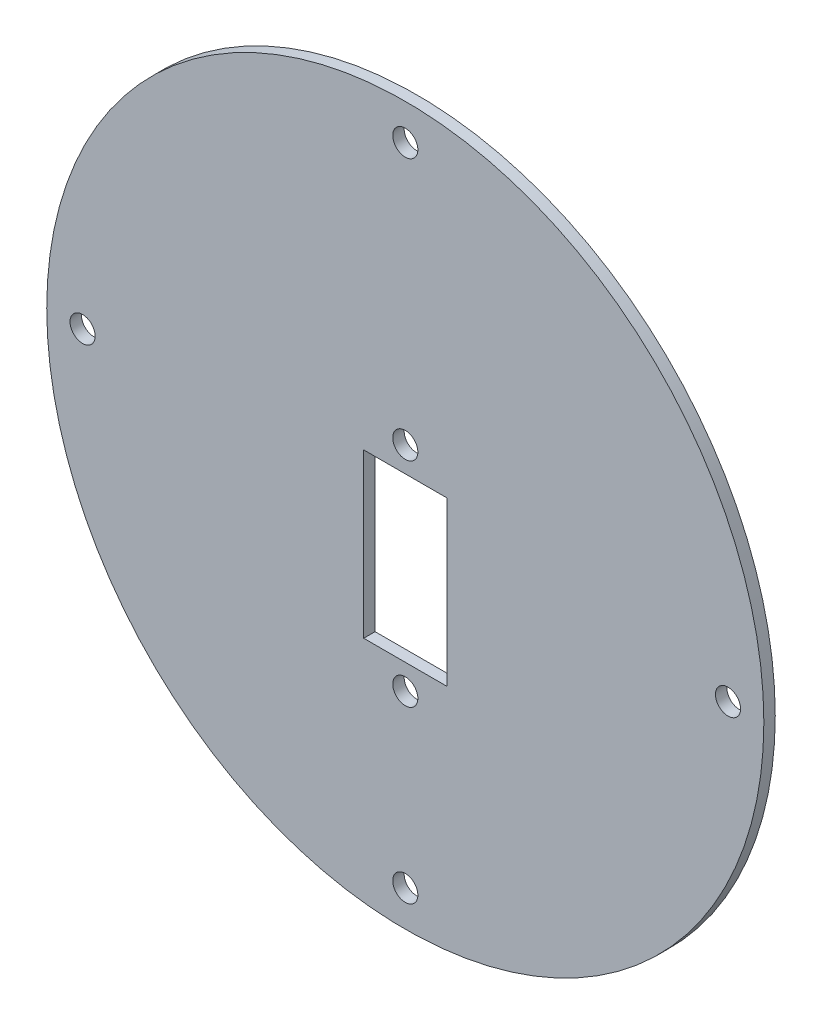
ISO-10303-21;
HEADER;
FILE_DESCRIPTION(('STEP AP214'),'2;1');
FILE_NAME('part.step','',(''),(''),'','','');
FILE_SCHEMA(('AUTOMOTIVE_DESIGN { 1 0 10303 214 1 1 1 1 }'));
ENDSEC;
DATA;
#1=APPLICATION_CONTEXT('core data for automotive mechanical design processes');
#2=APPLICATION_PROTOCOL_DEFINITION('international standard','automotive_design',2000,#1);
#3=PRODUCT_CONTEXT('',#1,'mechanical');
#4=PRODUCT('Part','Part','',(#3));
#5=PRODUCT_RELATED_PRODUCT_CATEGORY('part','',(#4));
#6=PRODUCT_DEFINITION_FORMATION('','',#4);
#7=PRODUCT_DEFINITION_CONTEXT('part definition',#1,'design');
#8=PRODUCT_DEFINITION('design','',#6,#7);
#9=PRODUCT_DEFINITION_SHAPE('','',#8);
#10=(LENGTH_UNIT() NAMED_UNIT(*) SI_UNIT(.MILLI.,.METRE.));
#11=(NAMED_UNIT(*) PLANE_ANGLE_UNIT() SI_UNIT($,.RADIAN.));
#12=(NAMED_UNIT(*) SI_UNIT($,.STERADIAN.) SOLID_ANGLE_UNIT());
#13=UNCERTAINTY_MEASURE_WITH_UNIT(LENGTH_MEASURE(1.E-05),#10,'distance_accuracy_value','');
#14=(GEOMETRIC_REPRESENTATION_CONTEXT(3) GLOBAL_UNCERTAINTY_ASSIGNED_CONTEXT((#13)) GLOBAL_UNIT_ASSIGNED_CONTEXT((#10,
#11,#12)) REPRESENTATION_CONTEXT('',''));
#15=CARTESIAN_POINT('',(0.,0.,0.));
#16=DIRECTION('',(0.,0.,1.));
#17=DIRECTION('',(1.,0.,0.));
#18=AXIS2_PLACEMENT_3D('',#15,#16,#17);
#19=CARTESIAN_POINT('',(0.,0.,1.59));
#20=DIRECTION('',(0.,0.,-1.));
#21=DIRECTION('',(-1.,0.,0.));
#22=AXIS2_PLACEMENT_3D('',#19,#20,#21);
#23=CYLINDRICAL_SURFACE('',#22,50.);
#24=CARTESIAN_POINT('',(0.,0.,1.59));
#25=DIRECTION('',(0.,0.,1.));
#26=DIRECTION('',(1.,0.,0.));
#27=AXIS2_PLACEMENT_3D('',#24,#25,#26);
#28=CIRCLE('',#27,50.);
#29=CARTESIAN_POINT('',(-50.,0.,1.59));
#30=VERTEX_POINT('',#29);
#31=EDGE_CURVE('E131',#30,#30,#28,.T.);
#32=CARTESIAN_POINT('',(0.,0.,0.));
#33=DIRECTION('',(0.,0.,1.));
#34=DIRECTION('',(1.,0.,0.));
#35=AXIS2_PLACEMENT_3D('',#32,#33,#34);
#36=CIRCLE('',#35,50.);
#37=CARTESIAN_POINT('',(-50.,0.,0.));
#38=VERTEX_POINT('',#37);
#39=EDGE_CURVE('E128',#38,#38,#36,.T.);
#40=CARTESIAN_POINT('',(-50.,0.,1.59));
#41=CARTESIAN_POINT('',(-50.,0.,1.5734375));
#42=CARTESIAN_POINT('',(-50.,0.,1.556875));
#43=CARTESIAN_POINT('',(-50.,0.,1.52375));
#44=CARTESIAN_POINT('',(-50.,0.,1.5071875));
#45=CARTESIAN_POINT('',(-50.,0.,1.4740625));
#46=CARTESIAN_POINT('',(-50.,0.,1.4575));
#47=CARTESIAN_POINT('',(-50.,0.,1.424375));
#48=CARTESIAN_POINT('',(-50.,0.,1.4078125));
#49=CARTESIAN_POINT('',(-50.,0.,1.3746875));
#50=CARTESIAN_POINT('',(-50.,0.,1.358125));
#51=CARTESIAN_POINT('',(-50.,0.,1.325));
#52=CARTESIAN_POINT('',(-50.,0.,1.3084375));
#53=CARTESIAN_POINT('',(-50.,0.,1.2753125));
#54=CARTESIAN_POINT('',(-50.,0.,1.25875));
#55=CARTESIAN_POINT('',(-50.,0.,1.225625));
#56=CARTESIAN_POINT('',(-50.,0.,1.2090625));
#57=CARTESIAN_POINT('',(-50.,0.,1.1759375));
#58=CARTESIAN_POINT('',(-50.,0.,1.159375));
#59=CARTESIAN_POINT('',(-50.,0.,1.12625));
#60=CARTESIAN_POINT('',(-50.,0.,1.1096875));
#61=CARTESIAN_POINT('',(-50.,0.,1.0765625));
#62=CARTESIAN_POINT('',(-50.,0.,1.06));
#63=CARTESIAN_POINT('',(-50.,0.,1.026875));
#64=CARTESIAN_POINT('',(-50.,0.,1.0103125));
#65=CARTESIAN_POINT('',(-50.,0.,0.9771875));
#66=CARTESIAN_POINT('',(-50.,0.,0.960625));
#67=CARTESIAN_POINT('',(-50.,0.,0.9275));
#68=CARTESIAN_POINT('',(-50.,0.,0.9109375));
#69=CARTESIAN_POINT('',(-50.,0.,0.8778125));
#70=CARTESIAN_POINT('',(-50.,0.,0.86125));
#71=CARTESIAN_POINT('',(-50.,0.,0.828125));
#72=CARTESIAN_POINT('',(-50.,0.,0.8115625));
#73=CARTESIAN_POINT('',(-50.,0.,0.7784375));
#74=CARTESIAN_POINT('',(-50.,0.,0.761875));
#75=CARTESIAN_POINT('',(-50.,0.,0.72875));
#76=CARTESIAN_POINT('',(-50.,0.,0.7121875));
#77=CARTESIAN_POINT('',(-50.,0.,0.6790625));
#78=CARTESIAN_POINT('',(-50.,0.,0.6625));
#79=CARTESIAN_POINT('',(-50.,0.,0.629375));
#80=CARTESIAN_POINT('',(-50.,0.,0.6128125));
#81=CARTESIAN_POINT('',(-50.,0.,0.5796875));
#82=CARTESIAN_POINT('',(-50.,0.,0.563125));
#83=CARTESIAN_POINT('',(-50.,0.,0.53));
#84=CARTESIAN_POINT('',(-50.,0.,0.5134375));
#85=CARTESIAN_POINT('',(-50.,0.,0.4803125));
#86=CARTESIAN_POINT('',(-50.,0.,0.46375));
#87=CARTESIAN_POINT('',(-50.,0.,0.430625));
#88=CARTESIAN_POINT('',(-50.,0.,0.4140625));
#89=CARTESIAN_POINT('',(-50.,0.,0.3809375));
#90=CARTESIAN_POINT('',(-50.,0.,0.364375));
#91=CARTESIAN_POINT('',(-50.,0.,0.33125));
#92=CARTESIAN_POINT('',(-50.,0.,0.3146875));
#93=CARTESIAN_POINT('',(-50.,0.,0.2815625));
#94=CARTESIAN_POINT('',(-50.,0.,0.265));
#95=CARTESIAN_POINT('',(-50.,0.,0.231875));
#96=CARTESIAN_POINT('',(-50.,0.,0.2153125));
#97=CARTESIAN_POINT('',(-50.,0.,0.1821875));
#98=CARTESIAN_POINT('',(-50.,0.,0.165625));
#99=CARTESIAN_POINT('',(-50.,0.,0.1325));
#100=CARTESIAN_POINT('',(-50.,0.,0.1159375));
#101=CARTESIAN_POINT('',(-50.,0.,0.0828125000000001));
#102=CARTESIAN_POINT('',(-50.,0.,0.06625));
#103=CARTESIAN_POINT('',(-50.,0.,0.033125));
#104=CARTESIAN_POINT('',(-50.,0.,0.0165625));
#105=CARTESIAN_POINT('',(-50.,0.,0.));
#106=B_SPLINE_CURVE_WITH_KNOTS('',3,(#40,#41,#42,#43,#44,#45,#46,#47,#48,#49,#50,#51,#52,#53,
#54,#55,#56,#57,#58,#59,#60,#61,#62,#63,#64,#65,#66,#67,#68,#69,#70,#71,#72,#73,#74,#75,#76,#77,
#78,#79,#80,#81,#82,#83,#84,#85,#86,#87,#88,#89,#90,#91,#92,#93,#94,#95,#96,#97,#98,#99,#100,
#101,#102,#103,#104,#105),.UNSPECIFIED.,.F.,.F.,(4,2,2,2,2,2,2,2,2,2,2,2,2,2,2,2,2,2,2,2,2,2,2,
2,2,2,2,2,2,2,2,2,4),(0.,0.0496875,0.0993750000000001,0.1490625,0.19875,0.2484375,0.298125,
0.3478125,0.3975,0.4471875,0.496875,0.5465625,0.59625,0.6459375,0.695625,0.7453125,0.795,
0.8446875,0.894375,0.9440625,0.99375,1.0434375,1.093125,1.1428125,1.1925,1.2421875,1.291875,
1.3415625,1.39125,1.4409375,1.490625,1.5403125,1.59),.UNSPECIFIED.);
#107=EDGE_CURVE('BSEAM36',#30,#38,#106,.T.);
#108=ORIENTED_EDGE('',*,*,#31,.F.);
#109=ORIENTED_EDGE('',*,*,#39,.T.);
#110=ORIENTED_EDGE('',*,*,#107,.T.);
#111=ORIENTED_EDGE('',*,*,#107,.F.);
#112=EDGE_LOOP('',(#108,#110,#109,#111));
#113=FACE_BOUND('',#112,.T.);
#114=ADVANCED_FACE('F36',(#113),#23,.T.);
#115=CARTESIAN_POINT('',(0.,0.,1.59));
#116=DIRECTION('',(0.,0.,1.));
#117=DIRECTION('',(1.,0.,0.));
#118=AXIS2_PLACEMENT_3D('',#115,#116,#117);
#119=PLANE('',#118);
#120=CARTESIAN_POINT('',(0.,8.5,1.59));
#121=DIRECTION('',(0.,0.,1.));
#122=DIRECTION('',(1.,0.,0.));
#123=AXIS2_PLACEMENT_3D('',#120,#121,#122);
#124=CIRCLE('',#123,1.75);
#125=CARTESIAN_POINT('',(1.75,8.5,1.59));
#126=VERTEX_POINT('',#125);
#127=EDGE_CURVE('E142',#126,#126,#124,.T.);
#128=ORIENTED_EDGE('',*,*,#127,.F.);
#129=EDGE_LOOP('',(#128));
#130=FACE_BOUND('',#129,.T.);
#131=CARTESIAN_POINT('',(0.,-21.25,1.59));
#132=DIRECTION('',(0.,0.,1.));
#133=DIRECTION('',(1.,0.,0.));
#134=AXIS2_PLACEMENT_3D('',#131,#132,#133);
#135=CIRCLE('',#134,1.75);
#136=CARTESIAN_POINT('',(1.75,-21.25,1.59));
#137=VERTEX_POINT('',#136);
#138=EDGE_CURVE('E147',#137,#137,#135,.T.);
#139=ORIENTED_EDGE('',*,*,#138,.F.);
#140=EDGE_LOOP('',(#139));
#141=FACE_BOUND('',#140,.T.);
#142=DIRECTION('',(0.,1.,0.));
#143=VECTOR('',#142,1.);
#144=CARTESIAN_POINT('',(5.8,5.,1.59));
#145=LINE('',#144,#143);
#146=CARTESIAN_POINT('',(5.8,-17.75,1.59));
#147=VERTEX_POINT('',#146);
#148=CARTESIAN_POINT('',(5.8,5.,1.59));
#149=VERTEX_POINT('',#148);
#150=EDGE_CURVE('E52',#147,#149,#145,.T.);
#151=ORIENTED_EDGE('',*,*,#150,.F.);
#152=DIRECTION('',(1.,0.,0.));
#153=VECTOR('',#152,1.);
#154=CARTESIAN_POINT('',(-5.8,-17.75,1.59));
#155=LINE('',#154,#153);
#156=CARTESIAN_POINT('',(-5.8,-17.75,1.59));
#157=VERTEX_POINT('',#156);
#158=EDGE_CURVE('E97',#157,#147,#155,.T.);
#159=ORIENTED_EDGE('',*,*,#158,.F.);
#160=DIRECTION('',(0.,-1.,0.));
#161=VECTOR('',#160,1.);
#162=CARTESIAN_POINT('',(-5.8,5.,1.59));
#163=LINE('',#162,#161);
#164=CARTESIAN_POINT('',(-5.8,5.,1.59));
#165=VERTEX_POINT('',#164);
#166=EDGE_CURVE('E81',#165,#157,#163,.T.);
#167=ORIENTED_EDGE('',*,*,#166,.F.);
#168=DIRECTION('',(-1.,0.,0.));
#169=VECTOR('',#168,1.);
#170=CARTESIAN_POINT('',(-5.8,5.,1.59));
#171=LINE('',#170,#169);
#172=EDGE_CURVE('E90',#149,#165,#171,.T.);
#173=ORIENTED_EDGE('',*,*,#172,.F.);
#174=EDGE_LOOP('',(#151,#159,#167,#173));
#175=FACE_BOUND('',#174,.T.);
#176=CARTESIAN_POINT('',(45.0000000000013,1.27346601377202E-12,1.59));
#177=DIRECTION('',(0.,0.,1.));
#178=DIRECTION('',(1.,0.,0.));
#179=AXIS2_PLACEMENT_3D('',#176,#177,#178);
#180=CIRCLE('',#179,1.750000000001);
#181=CARTESIAN_POINT('',(46.7500000000023,1.27346601377202E-12,1.59));
#182=VERTEX_POINT('',#181);
#183=EDGE_CURVE('E111',#182,#182,#180,.T.);
#184=ORIENTED_EDGE('',*,*,#183,.F.);
#185=EDGE_LOOP('',(#184));
#186=FACE_BOUND('',#185,.T.);
#187=CARTESIAN_POINT('',(2.54693202754404E-12,-45.,1.59));
#188=DIRECTION('',(0.,0.,1.));
#189=DIRECTION('',(1.,0.,0.));
#190=AXIS2_PLACEMENT_3D('',#187,#188,#189);
#191=CIRCLE('',#190,1.75000000000274);
#192=CARTESIAN_POINT('',(1.75000000000529,-45.,1.59));
#193=VERTEX_POINT('',#192);
#194=EDGE_CURVE('E117',#193,#193,#191,.T.);
#195=ORIENTED_EDGE('',*,*,#194,.F.);
#196=EDGE_LOOP('',(#195));
#197=FACE_BOUND('',#196,.T.);
#198=CARTESIAN_POINT('',(-44.9999999999987,-1.27897692436818E-12,1.59));
#199=DIRECTION('',(0.,0.,1.));
#200=DIRECTION('',(1.,0.,0.));
#201=AXIS2_PLACEMENT_3D('',#198,#199,#200);
#202=CIRCLE('',#201,1.75000000000205);
#203=CARTESIAN_POINT('',(-43.2499999999967,-1.27897692436818E-12,1.59));
#204=VERTEX_POINT('',#203);
#205=EDGE_CURVE('E104',#204,#204,#202,.T.);
#206=ORIENTED_EDGE('',*,*,#205,.F.);
#207=EDGE_LOOP('',(#206));
#208=FACE_BOUND('',#207,.T.);
#209=CARTESIAN_POINT('',(0.,45.,1.59));
#210=DIRECTION('',(0.,0.,1.));
#211=DIRECTION('',(1.,0.,0.));
#212=AXIS2_PLACEMENT_3D('',#209,#210,#211);
#213=CIRCLE('',#212,1.75);
#214=CARTESIAN_POINT('',(1.75,45.,1.59));
#215=VERTEX_POINT('',#214);
#216=EDGE_CURVE('E110',#215,#215,#213,.T.);
#217=ORIENTED_EDGE('',*,*,#216,.F.);
#218=EDGE_LOOP('',(#217));
#219=FACE_BOUND('',#218,.T.);
#220=ORIENTED_EDGE('',*,*,#31,.T.);
#221=EDGE_LOOP('',(#220));
#222=FACE_BOUND('',#221,.T.);
#223=ADVANCED_FACE('F94',(#130,#141,#175,#186,#197,#208,#219,#222),#119,.T.);
#224=CARTESIAN_POINT('',(0.,0.,0.));
#225=DIRECTION('',(0.,0.,1.));
#226=DIRECTION('',(1.,0.,0.));
#227=AXIS2_PLACEMENT_3D('',#224,#225,#226);
#228=PLANE('',#227);
#229=CARTESIAN_POINT('',(0.,8.5,0.));
#230=DIRECTION('',(0.,0.,1.));
#231=DIRECTION('',(1.,0.,0.));
#232=AXIS2_PLACEMENT_3D('',#229,#230,#231);
#233=CIRCLE('',#232,1.75);
#234=CARTESIAN_POINT('',(1.75,8.5,0.));
#235=VERTEX_POINT('',#234);
#236=EDGE_CURVE('E39',#235,#235,#233,.T.);
#237=ORIENTED_EDGE('',*,*,#236,.T.);
#238=EDGE_LOOP('',(#237));
#239=FACE_BOUND('',#238,.T.);
#240=CARTESIAN_POINT('',(0.,-21.25,0.));
#241=DIRECTION('',(0.,0.,1.));
#242=DIRECTION('',(1.,0.,0.));
#243=AXIS2_PLACEMENT_3D('',#240,#241,#242);
#244=CIRCLE('',#243,1.75);
#245=CARTESIAN_POINT('',(1.75,-21.25,0.));
#246=VERTEX_POINT('',#245);
#247=EDGE_CURVE('E140',#246,#246,#244,.T.);
#248=ORIENTED_EDGE('',*,*,#247,.T.);
#249=EDGE_LOOP('',(#248));
#250=FACE_BOUND('',#249,.T.);
#251=DIRECTION('',(1.,0.,0.));
#252=VECTOR('',#251,1.);
#253=CARTESIAN_POINT('',(0.,-17.75,0.));
#254=LINE('',#253,#252);
#255=CARTESIAN_POINT('',(-5.8,-17.75,0.));
#256=VERTEX_POINT('',#255);
#257=CARTESIAN_POINT('',(5.8,-17.75,0.));
#258=VERTEX_POINT('',#257);
#259=EDGE_CURVE('E44',#256,#258,#254,.T.);
#260=ORIENTED_EDGE('',*,*,#259,.T.);
#261=DIRECTION('',(0.,1.,0.));
#262=VECTOR('',#261,1.);
#263=CARTESIAN_POINT('',(5.8,0.,0.));
#264=LINE('',#263,#262);
#265=CARTESIAN_POINT('',(5.8,5.,0.));
#266=VERTEX_POINT('',#265);
#267=EDGE_CURVE('E11',#258,#266,#264,.T.);
#268=ORIENTED_EDGE('',*,*,#267,.T.);
#269=DIRECTION('',(-1.,0.,0.));
#270=VECTOR('',#269,1.);
#271=CARTESIAN_POINT('',(0.,5.,0.));
#272=LINE('',#271,#270);
#273=CARTESIAN_POINT('',(-5.8,5.,0.));
#274=VERTEX_POINT('',#273);
#275=EDGE_CURVE('E134',#266,#274,#272,.T.);
#276=ORIENTED_EDGE('',*,*,#275,.T.);
#277=DIRECTION('',(0.,-1.,0.));
#278=VECTOR('',#277,1.);
#279=CARTESIAN_POINT('',(-5.8,0.,0.));
#280=LINE('',#279,#278);
#281=EDGE_CURVE('E84',#274,#256,#280,.T.);
#282=ORIENTED_EDGE('',*,*,#281,.T.);
#283=EDGE_LOOP('',(#260,#268,#276,#282));
#284=FACE_BOUND('',#283,.T.);
#285=CARTESIAN_POINT('',(45.0000000000013,1.27346601377202E-12,0.));
#286=DIRECTION('',(0.,0.,1.));
#287=DIRECTION('',(1.,0.,0.));
#288=AXIS2_PLACEMENT_3D('',#285,#286,#287);
#289=CIRCLE('',#288,1.750000000001);
#290=CARTESIAN_POINT('',(46.7500000000023,1.27346601377202E-12,0.));
#291=VERTEX_POINT('',#290);
#292=EDGE_CURVE('E107',#291,#291,#289,.T.);
#293=ORIENTED_EDGE('',*,*,#292,.T.);
#294=EDGE_LOOP('',(#293));
#295=FACE_BOUND('',#294,.T.);
#296=CARTESIAN_POINT('',(2.54693202754404E-12,-45.,0.));
#297=DIRECTION('',(0.,0.,1.));
#298=DIRECTION('',(1.,0.,0.));
#299=AXIS2_PLACEMENT_3D('',#296,#297,#298);
#300=CIRCLE('',#299,1.75000000000274);
#301=CARTESIAN_POINT('',(1.75000000000529,-45.,0.));
#302=VERTEX_POINT('',#301);
#303=EDGE_CURVE('E114',#302,#302,#300,.T.);
#304=ORIENTED_EDGE('',*,*,#303,.T.);
#305=EDGE_LOOP('',(#304));
#306=FACE_BOUND('',#305,.T.);
#307=CARTESIAN_POINT('',(-44.9999999999987,-1.27897692436818E-12,0.));
#308=DIRECTION('',(0.,0.,1.));
#309=DIRECTION('',(1.,0.,0.));
#310=AXIS2_PLACEMENT_3D('',#307,#308,#309);
#311=CIRCLE('',#310,1.75000000000205);
#312=CARTESIAN_POINT('',(-43.2499999999967,-1.27897692436818E-12,0.));
#313=VERTEX_POINT('',#312);
#314=EDGE_CURVE('E120',#313,#313,#311,.T.);
#315=ORIENTED_EDGE('',*,*,#314,.T.);
#316=EDGE_LOOP('',(#315));
#317=FACE_BOUND('',#316,.T.);
#318=CARTESIAN_POINT('',(0.,45.,0.));
#319=DIRECTION('',(0.,0.,1.));
#320=DIRECTION('',(1.,0.,0.));
#321=AXIS2_PLACEMENT_3D('',#318,#319,#320);
#322=CIRCLE('',#321,1.75);
#323=CARTESIAN_POINT('',(1.75,45.,0.));
#324=VERTEX_POINT('',#323);
#325=EDGE_CURVE('E125',#324,#324,#322,.T.);
#326=ORIENTED_EDGE('',*,*,#325,.T.);
#327=EDGE_LOOP('',(#326));
#328=FACE_BOUND('',#327,.T.);
#329=ORIENTED_EDGE('',*,*,#39,.F.);
#330=EDGE_LOOP('',(#329));
#331=FACE_BOUND('',#330,.T.);
#332=ADVANCED_FACE('F159',(#239,#250,#284,#295,#306,#317,#328,#331),#228,.F.);
#333=CARTESIAN_POINT('',(0.,45.,0.));
#334=DIRECTION('',(0.,0.,1.));
#335=DIRECTION('',(1.,0.,0.));
#336=AXIS2_PLACEMENT_3D('',#333,#334,#335);
#337=CYLINDRICAL_SURFACE('',#336,1.75);
#338=CARTESIAN_POINT('',(1.75,45.,0.));
#339=CARTESIAN_POINT('',(1.75,45.,0.0165625));
#340=CARTESIAN_POINT('',(1.75,45.,0.033125));
#341=CARTESIAN_POINT('',(1.75,45.,0.06625));
#342=CARTESIAN_POINT('',(1.75,45.,0.0828125));
#343=CARTESIAN_POINT('',(1.75,45.,0.1159375));
#344=CARTESIAN_POINT('',(1.75,45.,0.1325));
#345=CARTESIAN_POINT('',(1.75,45.,0.165625));
#346=CARTESIAN_POINT('',(1.75,45.,0.1821875));
#347=CARTESIAN_POINT('',(1.75,45.,0.2153125));
#348=CARTESIAN_POINT('',(1.75,45.,0.231875));
#349=CARTESIAN_POINT('',(1.75,45.,0.265));
#350=CARTESIAN_POINT('',(1.75,45.,0.2815625));
#351=CARTESIAN_POINT('',(1.75,45.,0.3146875));
#352=CARTESIAN_POINT('',(1.75,45.,0.33125));
#353=CARTESIAN_POINT('',(1.75,45.,0.364375));
#354=CARTESIAN_POINT('',(1.75,45.,0.3809375));
#355=CARTESIAN_POINT('',(1.75,45.,0.4140625));
#356=CARTESIAN_POINT('',(1.75,45.,0.430625));
#357=CARTESIAN_POINT('',(1.75,45.,0.46375));
#358=CARTESIAN_POINT('',(1.75,45.,0.4803125));
#359=CARTESIAN_POINT('',(1.75,45.,0.5134375));
#360=CARTESIAN_POINT('',(1.75,45.,0.53));
#361=CARTESIAN_POINT('',(1.75,45.,0.563125));
#362=CARTESIAN_POINT('',(1.75,45.,0.5796875));
#363=CARTESIAN_POINT('',(1.75,45.,0.6128125));
#364=CARTESIAN_POINT('',(1.75,45.,0.629375));
#365=CARTESIAN_POINT('',(1.75,45.,0.6625));
#366=CARTESIAN_POINT('',(1.75,45.,0.6790625));
#367=CARTESIAN_POINT('',(1.75,45.,0.7121875));
#368=CARTESIAN_POINT('',(1.75,45.,0.72875));
#369=CARTESIAN_POINT('',(1.75,45.,0.761875));
#370=CARTESIAN_POINT('',(1.75,45.,0.7784375));
#371=CARTESIAN_POINT('',(1.75,45.,0.8115625));
#372=CARTESIAN_POINT('',(1.75,45.,0.828125));
#373=CARTESIAN_POINT('',(1.75,45.,0.86125));
#374=CARTESIAN_POINT('',(1.75,45.,0.8778125));
#375=CARTESIAN_POINT('',(1.75,45.,0.9109375));
#376=CARTESIAN_POINT('',(1.75,45.,0.9275));
#377=CARTESIAN_POINT('',(1.75,45.,0.960625));
#378=CARTESIAN_POINT('',(1.75,45.,0.9771875));
#379=CARTESIAN_POINT('',(1.75,45.,1.0103125));
#380=CARTESIAN_POINT('',(1.75,45.,1.026875));
#381=CARTESIAN_POINT('',(1.75,45.,1.06));
#382=CARTESIAN_POINT('',(1.75,45.,1.0765625));
#383=CARTESIAN_POINT('',(1.75,45.,1.1096875));
#384=CARTESIAN_POINT('',(1.75,45.,1.12625));
#385=CARTESIAN_POINT('',(1.75,45.,1.159375));
#386=CARTESIAN_POINT('',(1.75,45.,1.1759375));
#387=CARTESIAN_POINT('',(1.75,45.,1.2090625));
#388=CARTESIAN_POINT('',(1.75,45.,1.225625));
#389=CARTESIAN_POINT('',(1.75,45.,1.25875));
#390=CARTESIAN_POINT('',(1.75,45.,1.2753125));
#391=CARTESIAN_POINT('',(1.75,45.,1.3084375));
#392=CARTESIAN_POINT('',(1.75,45.,1.325));
#393=CARTESIAN_POINT('',(1.75,45.,1.358125));
#394=CARTESIAN_POINT('',(1.75,45.,1.3746875));
#395=CARTESIAN_POINT('',(1.75,45.,1.4078125));
#396=CARTESIAN_POINT('',(1.75,45.,1.424375));
#397=CARTESIAN_POINT('',(1.75,45.,1.4575));
#398=CARTESIAN_POINT('',(1.75,45.,1.4740625));
#399=CARTESIAN_POINT('',(1.75,45.,1.5071875));
#400=CARTESIAN_POINT('',(1.75,45.,1.52375));
#401=CARTESIAN_POINT('',(1.75,45.,1.556875));
#402=CARTESIAN_POINT('',(1.75,45.,1.5734375));
#403=CARTESIAN_POINT('',(1.75,45.,1.59));
#404=B_SPLINE_CURVE_WITH_KNOTS('',3,(#338,#339,#340,#341,#342,#343,#344,#345,#346,#347,#348,
#349,#350,#351,#352,#353,#354,#355,#356,#357,#358,#359,#360,#361,#362,#363,#364,#365,#366,#367,
#368,#369,#370,#371,#372,#373,#374,#375,#376,#377,#378,#379,#380,#381,#382,#383,#384,#385,#386,
#387,#388,#389,#390,#391,#392,#393,#394,#395,#396,#397,#398,#399,#400,#401,#402,#403),
.UNSPECIFIED.,.F.,.F.,(4,2,2,2,2,2,2,2,2,2,2,2,2,2,2,2,2,2,2,2,2,2,2,2,2,2,2,2,2,2,2,2,4),(0.,
0.0496875,0.099375,0.1490625,0.19875,0.2484375,0.298125,0.3478125,0.3975,0.4471875,0.496875,
0.5465625,0.59625,0.6459375,0.695625,0.7453125,0.795,0.8446875,0.894375,0.9440625,0.99375,
1.0434375,1.093125,1.1428125,1.1925,1.2421875,1.291875,1.3415625,1.39125,1.4409375,1.490625,
1.5403125,1.59),.UNSPECIFIED.);
#405=EDGE_CURVE('BSEAM166',#324,#215,#404,.T.);
#406=ORIENTED_EDGE('',*,*,#325,.F.);
#407=ORIENTED_EDGE('',*,*,#216,.T.);
#408=ORIENTED_EDGE('',*,*,#405,.T.);
#409=ORIENTED_EDGE('',*,*,#405,.F.);
#410=EDGE_LOOP('',(#406,#408,#407,#409));
#411=FACE_BOUND('',#410,.T.);
#412=ADVANCED_FACE('F166',(#411),#337,.F.);
#413=CARTESIAN_POINT('',(-44.9999999999987,-1.27897692436818E-12,0.));
#414=DIRECTION('',(0.,0.,1.));
#415=DIRECTION('',(1.,0.,0.));
#416=AXIS2_PLACEMENT_3D('',#413,#414,#415);
#417=CYLINDRICAL_SURFACE('',#416,1.75000000000205);
#418=CARTESIAN_POINT('',(-43.2499999999967,-1.27897692436818E-12,0.));
#419=CARTESIAN_POINT('',(-43.2499999999967,-1.27897692436818E-12,0.0165625));
#420=CARTESIAN_POINT('',(-43.2499999999967,-1.27897692436818E-12,0.033125));
#421=CARTESIAN_POINT('',(-43.2499999999967,-1.27897692436818E-12,0.06625));
#422=CARTESIAN_POINT('',(-43.2499999999967,-1.27897692436818E-12,0.0828125));
#423=CARTESIAN_POINT('',(-43.2499999999967,-1.27897692436818E-12,0.1159375));
#424=CARTESIAN_POINT('',(-43.2499999999967,-1.27897692436818E-12,0.1325));
#425=CARTESIAN_POINT('',(-43.2499999999967,-1.27897692436818E-12,0.165625));
#426=CARTESIAN_POINT('',(-43.2499999999967,-1.27897692436818E-12,0.1821875));
#427=CARTESIAN_POINT('',(-43.2499999999967,-1.27897692436818E-12,0.2153125));
#428=CARTESIAN_POINT('',(-43.2499999999967,-1.27897692436818E-12,0.231875));
#429=CARTESIAN_POINT('',(-43.2499999999967,-1.27897692436818E-12,0.265));
#430=CARTESIAN_POINT('',(-43.2499999999967,-1.27897692436818E-12,0.2815625));
#431=CARTESIAN_POINT('',(-43.2499999999967,-1.27897692436818E-12,0.3146875));
#432=CARTESIAN_POINT('',(-43.2499999999967,-1.27897692436818E-12,0.33125));
#433=CARTESIAN_POINT('',(-43.2499999999967,-1.27897692436818E-12,0.364375));
#434=CARTESIAN_POINT('',(-43.2499999999967,-1.27897692436818E-12,0.3809375));
#435=CARTESIAN_POINT('',(-43.2499999999967,-1.27897692436818E-12,0.4140625));
#436=CARTESIAN_POINT('',(-43.2499999999967,-1.27897692436818E-12,0.430625));
#437=CARTESIAN_POINT('',(-43.2499999999967,-1.27897692436818E-12,0.46375));
#438=CARTESIAN_POINT('',(-43.2499999999967,-1.27897692436818E-12,0.4803125));
#439=CARTESIAN_POINT('',(-43.2499999999967,-1.27897692436818E-12,0.5134375));
#440=CARTESIAN_POINT('',(-43.2499999999967,-1.27897692436818E-12,0.53));
#441=CARTESIAN_POINT('',(-43.2499999999967,-1.27897692436818E-12,0.563125));
#442=CARTESIAN_POINT('',(-43.2499999999967,-1.27897692436818E-12,0.5796875));
#443=CARTESIAN_POINT('',(-43.2499999999967,-1.27897692436818E-12,0.6128125));
#444=CARTESIAN_POINT('',(-43.2499999999967,-1.27897692436818E-12,0.629375));
#445=CARTESIAN_POINT('',(-43.2499999999967,-1.27897692436818E-12,0.6625));
#446=CARTESIAN_POINT('',(-43.2499999999967,-1.27897692436818E-12,0.6790625));
#447=CARTESIAN_POINT('',(-43.2499999999967,-1.27897692436818E-12,0.7121875));
#448=CARTESIAN_POINT('',(-43.2499999999967,-1.27897692436818E-12,0.72875));
#449=CARTESIAN_POINT('',(-43.2499999999967,-1.27897692436818E-12,0.761875));
#450=CARTESIAN_POINT('',(-43.2499999999967,-1.27897692436818E-12,0.7784375));
#451=CARTESIAN_POINT('',(-43.2499999999967,-1.27897692436818E-12,0.8115625));
#452=CARTESIAN_POINT('',(-43.2499999999967,-1.27897692436818E-12,0.828125));
#453=CARTESIAN_POINT('',(-43.2499999999967,-1.27897692436818E-12,0.86125));
#454=CARTESIAN_POINT('',(-43.2499999999967,-1.27897692436818E-12,0.8778125));
#455=CARTESIAN_POINT('',(-43.2499999999967,-1.27897692436818E-12,0.9109375));
#456=CARTESIAN_POINT('',(-43.2499999999967,-1.27897692436818E-12,0.9275));
#457=CARTESIAN_POINT('',(-43.2499999999967,-1.27897692436818E-12,0.960625));
#458=CARTESIAN_POINT('',(-43.2499999999967,-1.27897692436818E-12,0.9771875));
#459=CARTESIAN_POINT('',(-43.2499999999967,-1.27897692436818E-12,1.0103125));
#460=CARTESIAN_POINT('',(-43.2499999999967,-1.27897692436818E-12,1.026875));
#461=CARTESIAN_POINT('',(-43.2499999999967,-1.27897692436818E-12,1.06));
#462=CARTESIAN_POINT('',(-43.2499999999967,-1.27897692436818E-12,1.0765625));
#463=CARTESIAN_POINT('',(-43.2499999999967,-1.27897692436818E-12,1.1096875));
#464=CARTESIAN_POINT('',(-43.2499999999967,-1.27897692436818E-12,1.12625));
#465=CARTESIAN_POINT('',(-43.2499999999967,-1.27897692436818E-12,1.159375));
#466=CARTESIAN_POINT('',(-43.2499999999967,-1.27897692436818E-12,1.1759375));
#467=CARTESIAN_POINT('',(-43.2499999999967,-1.27897692436818E-12,1.2090625));
#468=CARTESIAN_POINT('',(-43.2499999999967,-1.27897692436818E-12,1.225625));
#469=CARTESIAN_POINT('',(-43.2499999999967,-1.27897692436818E-12,1.25875));
#470=CARTESIAN_POINT('',(-43.2499999999967,-1.27897692436818E-12,1.2753125));
#471=CARTESIAN_POINT('',(-43.2499999999967,-1.27897692436818E-12,1.3084375));
#472=CARTESIAN_POINT('',(-43.2499999999967,-1.27897692436818E-12,1.325));
#473=CARTESIAN_POINT('',(-43.2499999999967,-1.27897692436818E-12,1.358125));
#474=CARTESIAN_POINT('',(-43.2499999999967,-1.27897692436818E-12,1.3746875));
#475=CARTESIAN_POINT('',(-43.2499999999967,-1.27897692436818E-12,1.4078125));
#476=CARTESIAN_POINT('',(-43.2499999999967,-1.27897692436818E-12,1.424375));
#477=CARTESIAN_POINT('',(-43.2499999999967,-1.27897692436818E-12,1.4575));
#478=CARTESIAN_POINT('',(-43.2499999999967,-1.27897692436818E-12,1.4740625));
#479=CARTESIAN_POINT('',(-43.2499999999967,-1.27897692436818E-12,1.5071875));
#480=CARTESIAN_POINT('',(-43.2499999999967,-1.27897692436818E-12,1.52375));
#481=CARTESIAN_POINT('',(-43.2499999999967,-1.27897692436818E-12,1.556875));
#482=CARTESIAN_POINT('',(-43.2499999999967,-1.27897692436818E-12,1.5734375));
#483=CARTESIAN_POINT('',(-43.2499999999967,-1.27897692436818E-12,1.59));
#484=B_SPLINE_CURVE_WITH_KNOTS('',3,(#418,#419,#420,#421,#422,#423,#424,#425,#426,#427,#428,
#429,#430,#431,#432,#433,#434,#435,#436,#437,#438,#439,#440,#441,#442,#443,#444,#445,#446,#447,
#448,#449,#450,#451,#452,#453,#454,#455,#456,#457,#458,#459,#460,#461,#462,#463,#464,#465,#466,
#467,#468,#469,#470,#471,#472,#473,#474,#475,#476,#477,#478,#479,#480,#481,#482,#483),
.UNSPECIFIED.,.F.,.F.,(4,2,2,2,2,2,2,2,2,2,2,2,2,2,2,2,2,2,2,2,2,2,2,2,2,2,2,2,2,2,2,2,4),(0.,
0.0496875,0.099375,0.1490625,0.19875,0.2484375,0.298125,0.3478125,0.3975,0.4471875,0.496875,
0.5465625,0.59625,0.6459375,0.695625,0.7453125,0.795,0.8446875,0.894375,0.9440625,0.99375,
1.0434375,1.093125,1.1428125,1.1925,1.2421875,1.291875,1.3415625,1.39125,1.4409375,1.490625,
1.5403125,1.59),.UNSPECIFIED.);
#485=EDGE_CURVE('BSEAM172',#313,#204,#484,.T.);
#486=ORIENTED_EDGE('',*,*,#314,.F.);
#487=ORIENTED_EDGE('',*,*,#205,.T.);
#488=ORIENTED_EDGE('',*,*,#485,.T.);
#489=ORIENTED_EDGE('',*,*,#485,.F.);
#490=EDGE_LOOP('',(#486,#488,#487,#489));
#491=FACE_BOUND('',#490,.T.);
#492=ADVANCED_FACE('F172',(#491),#417,.F.);
#493=CARTESIAN_POINT('',(2.54693202754404E-12,-45.,0.));
#494=DIRECTION('',(0.,0.,1.));
#495=DIRECTION('',(1.,0.,0.));
#496=AXIS2_PLACEMENT_3D('',#493,#494,#495);
#497=CYLINDRICAL_SURFACE('',#496,1.75000000000274);
#498=CARTESIAN_POINT('',(1.75000000000529,-45.,0.));
#499=CARTESIAN_POINT('',(1.75000000000529,-45.,0.0165625));
#500=CARTESIAN_POINT('',(1.75000000000529,-45.,0.033125));
#501=CARTESIAN_POINT('',(1.75000000000529,-45.,0.06625));
#502=CARTESIAN_POINT('',(1.75000000000529,-45.,0.0828125));
#503=CARTESIAN_POINT('',(1.75000000000529,-45.,0.1159375));
#504=CARTESIAN_POINT('',(1.75000000000529,-45.,0.1325));
#505=CARTESIAN_POINT('',(1.75000000000529,-45.,0.165625));
#506=CARTESIAN_POINT('',(1.75000000000529,-45.,0.1821875));
#507=CARTESIAN_POINT('',(1.75000000000529,-45.,0.2153125));
#508=CARTESIAN_POINT('',(1.75000000000529,-45.,0.231875));
#509=CARTESIAN_POINT('',(1.75000000000529,-45.,0.265));
#510=CARTESIAN_POINT('',(1.75000000000529,-45.,0.2815625));
#511=CARTESIAN_POINT('',(1.75000000000529,-45.,0.3146875));
#512=CARTESIAN_POINT('',(1.75000000000529,-45.,0.33125));
#513=CARTESIAN_POINT('',(1.75000000000529,-45.,0.364375));
#514=CARTESIAN_POINT('',(1.75000000000529,-45.,0.3809375));
#515=CARTESIAN_POINT('',(1.75000000000529,-45.,0.4140625));
#516=CARTESIAN_POINT('',(1.75000000000529,-45.,0.430625));
#517=CARTESIAN_POINT('',(1.75000000000529,-45.,0.46375));
#518=CARTESIAN_POINT('',(1.75000000000529,-45.,0.4803125));
#519=CARTESIAN_POINT('',(1.75000000000529,-45.,0.5134375));
#520=CARTESIAN_POINT('',(1.75000000000529,-45.,0.53));
#521=CARTESIAN_POINT('',(1.75000000000529,-45.,0.563125));
#522=CARTESIAN_POINT('',(1.75000000000529,-45.,0.5796875));
#523=CARTESIAN_POINT('',(1.75000000000529,-45.,0.6128125));
#524=CARTESIAN_POINT('',(1.75000000000529,-45.,0.629375));
#525=CARTESIAN_POINT('',(1.75000000000529,-45.,0.6625));
#526=CARTESIAN_POINT('',(1.75000000000529,-45.,0.6790625));
#527=CARTESIAN_POINT('',(1.75000000000529,-45.,0.7121875));
#528=CARTESIAN_POINT('',(1.75000000000529,-45.,0.72875));
#529=CARTESIAN_POINT('',(1.75000000000529,-45.,0.761875));
#530=CARTESIAN_POINT('',(1.75000000000529,-45.,0.7784375));
#531=CARTESIAN_POINT('',(1.75000000000529,-45.,0.8115625));
#532=CARTESIAN_POINT('',(1.75000000000529,-45.,0.828125));
#533=CARTESIAN_POINT('',(1.75000000000529,-45.,0.86125));
#534=CARTESIAN_POINT('',(1.75000000000529,-45.,0.8778125));
#535=CARTESIAN_POINT('',(1.75000000000529,-45.,0.9109375));
#536=CARTESIAN_POINT('',(1.75000000000529,-45.,0.9275));
#537=CARTESIAN_POINT('',(1.75000000000529,-45.,0.960625));
#538=CARTESIAN_POINT('',(1.75000000000529,-45.,0.9771875));
#539=CARTESIAN_POINT('',(1.75000000000529,-45.,1.0103125));
#540=CARTESIAN_POINT('',(1.75000000000529,-45.,1.026875));
#541=CARTESIAN_POINT('',(1.75000000000529,-45.,1.06));
#542=CARTESIAN_POINT('',(1.75000000000529,-45.,1.0765625));
#543=CARTESIAN_POINT('',(1.75000000000529,-45.,1.1096875));
#544=CARTESIAN_POINT('',(1.75000000000529,-45.,1.12625));
#545=CARTESIAN_POINT('',(1.75000000000529,-45.,1.159375));
#546=CARTESIAN_POINT('',(1.75000000000529,-45.,1.1759375));
#547=CARTESIAN_POINT('',(1.75000000000529,-45.,1.2090625));
#548=CARTESIAN_POINT('',(1.75000000000529,-45.,1.225625));
#549=CARTESIAN_POINT('',(1.75000000000529,-45.,1.25875));
#550=CARTESIAN_POINT('',(1.75000000000529,-45.,1.2753125));
#551=CARTESIAN_POINT('',(1.75000000000529,-45.,1.3084375));
#552=CARTESIAN_POINT('',(1.75000000000529,-45.,1.325));
#553=CARTESIAN_POINT('',(1.75000000000529,-45.,1.358125));
#554=CARTESIAN_POINT('',(1.75000000000529,-45.,1.3746875));
#555=CARTESIAN_POINT('',(1.75000000000529,-45.,1.4078125));
#556=CARTESIAN_POINT('',(1.75000000000529,-45.,1.424375));
#557=CARTESIAN_POINT('',(1.75000000000529,-45.,1.4575));
#558=CARTESIAN_POINT('',(1.75000000000529,-45.,1.4740625));
#559=CARTESIAN_POINT('',(1.75000000000529,-45.,1.5071875));
#560=CARTESIAN_POINT('',(1.75000000000529,-45.,1.52375));
#561=CARTESIAN_POINT('',(1.75000000000529,-45.,1.556875));
#562=CARTESIAN_POINT('',(1.75000000000529,-45.,1.5734375));
#563=CARTESIAN_POINT('',(1.75000000000529,-45.,1.59));
#564=B_SPLINE_CURVE_WITH_KNOTS('',3,(#498,#499,#500,#501,#502,#503,#504,#505,#506,#507,#508,
#509,#510,#511,#512,#513,#514,#515,#516,#517,#518,#519,#520,#521,#522,#523,#524,#525,#526,#527,
#528,#529,#530,#531,#532,#533,#534,#535,#536,#537,#538,#539,#540,#541,#542,#543,#544,#545,#546,
#547,#548,#549,#550,#551,#552,#553,#554,#555,#556,#557,#558,#559,#560,#561,#562,#563),
.UNSPECIFIED.,.F.,.F.,(4,2,2,2,2,2,2,2,2,2,2,2,2,2,2,2,2,2,2,2,2,2,2,2,2,2,2,2,2,2,2,2,4),(0.,
0.0496875,0.099375,0.1490625,0.19875,0.2484375,0.298125,0.3478125,0.3975,0.4471875,0.496875,
0.5465625,0.59625,0.6459375,0.695625,0.7453125,0.795,0.8446875,0.894375,0.9440625,0.99375,
1.0434375,1.093125,1.1428125,1.1925,1.2421875,1.291875,1.3415625,1.39125,1.4409375,1.490625,
1.5403125,1.59),.UNSPECIFIED.);
#565=EDGE_CURVE('BSEAM176',#302,#193,#564,.T.);
#566=ORIENTED_EDGE('',*,*,#303,.F.);
#567=ORIENTED_EDGE('',*,*,#194,.T.);
#568=ORIENTED_EDGE('',*,*,#565,.T.);
#569=ORIENTED_EDGE('',*,*,#565,.F.);
#570=EDGE_LOOP('',(#566,#568,#567,#569));
#571=FACE_BOUND('',#570,.T.);
#572=ADVANCED_FACE('F176',(#571),#497,.F.);
#573=CARTESIAN_POINT('',(45.0000000000013,1.27346601377202E-12,0.));
#574=DIRECTION('',(0.,0.,1.));
#575=DIRECTION('',(1.,0.,0.));
#576=AXIS2_PLACEMENT_3D('',#573,#574,#575);
#577=CYLINDRICAL_SURFACE('',#576,1.750000000001);
#578=CARTESIAN_POINT('',(46.7500000000023,1.27346601377202E-12,0.));
#579=CARTESIAN_POINT('',(46.7500000000023,1.27346601377202E-12,0.0165625));
#580=CARTESIAN_POINT('',(46.7500000000023,1.27346601377202E-12,0.033125));
#581=CARTESIAN_POINT('',(46.7500000000023,1.27346601377202E-12,0.06625));
#582=CARTESIAN_POINT('',(46.7500000000023,1.27346601377202E-12,0.0828125));
#583=CARTESIAN_POINT('',(46.7500000000023,1.27346601377202E-12,0.1159375));
#584=CARTESIAN_POINT('',(46.7500000000023,1.27346601377202E-12,0.1325));
#585=CARTESIAN_POINT('',(46.7500000000023,1.27346601377202E-12,0.165625));
#586=CARTESIAN_POINT('',(46.7500000000023,1.27346601377202E-12,0.1821875));
#587=CARTESIAN_POINT('',(46.7500000000023,1.27346601377202E-12,0.2153125));
#588=CARTESIAN_POINT('',(46.7500000000023,1.27346601377202E-12,0.231875));
#589=CARTESIAN_POINT('',(46.7500000000023,1.27346601377202E-12,0.265));
#590=CARTESIAN_POINT('',(46.7500000000023,1.27346601377202E-12,0.2815625));
#591=CARTESIAN_POINT('',(46.7500000000023,1.27346601377202E-12,0.3146875));
#592=CARTESIAN_POINT('',(46.7500000000023,1.27346601377202E-12,0.33125));
#593=CARTESIAN_POINT('',(46.7500000000023,1.27346601377202E-12,0.364375));
#594=CARTESIAN_POINT('',(46.7500000000023,1.27346601377202E-12,0.3809375));
#595=CARTESIAN_POINT('',(46.7500000000023,1.27346601377202E-12,0.4140625));
#596=CARTESIAN_POINT('',(46.7500000000023,1.27346601377202E-12,0.430625));
#597=CARTESIAN_POINT('',(46.7500000000023,1.27346601377202E-12,0.46375));
#598=CARTESIAN_POINT('',(46.7500000000023,1.27346601377202E-12,0.4803125));
#599=CARTESIAN_POINT('',(46.7500000000023,1.27346601377202E-12,0.5134375));
#600=CARTESIAN_POINT('',(46.7500000000023,1.27346601377202E-12,0.53));
#601=CARTESIAN_POINT('',(46.7500000000023,1.27346601377202E-12,0.563125));
#602=CARTESIAN_POINT('',(46.7500000000023,1.27346601377202E-12,0.5796875));
#603=CARTESIAN_POINT('',(46.7500000000023,1.27346601377202E-12,0.6128125));
#604=CARTESIAN_POINT('',(46.7500000000023,1.27346601377202E-12,0.629375));
#605=CARTESIAN_POINT('',(46.7500000000023,1.27346601377202E-12,0.6625));
#606=CARTESIAN_POINT('',(46.7500000000023,1.27346601377202E-12,0.6790625));
#607=CARTESIAN_POINT('',(46.7500000000023,1.27346601377202E-12,0.7121875));
#608=CARTESIAN_POINT('',(46.7500000000023,1.27346601377202E-12,0.72875));
#609=CARTESIAN_POINT('',(46.7500000000023,1.27346601377202E-12,0.761875));
#610=CARTESIAN_POINT('',(46.7500000000023,1.27346601377202E-12,0.7784375));
#611=CARTESIAN_POINT('',(46.7500000000023,1.27346601377202E-12,0.8115625));
#612=CARTESIAN_POINT('',(46.7500000000023,1.27346601377202E-12,0.828125));
#613=CARTESIAN_POINT('',(46.7500000000023,1.27346601377202E-12,0.86125));
#614=CARTESIAN_POINT('',(46.7500000000023,1.27346601377202E-12,0.8778125));
#615=CARTESIAN_POINT('',(46.7500000000023,1.27346601377202E-12,0.9109375));
#616=CARTESIAN_POINT('',(46.7500000000023,1.27346601377202E-12,0.9275));
#617=CARTESIAN_POINT('',(46.7500000000023,1.27346601377202E-12,0.960625));
#618=CARTESIAN_POINT('',(46.7500000000023,1.27346601377202E-12,0.9771875));
#619=CARTESIAN_POINT('',(46.7500000000023,1.27346601377202E-12,1.0103125));
#620=CARTESIAN_POINT('',(46.7500000000023,1.27346601377202E-12,1.026875));
#621=CARTESIAN_POINT('',(46.7500000000023,1.27346601377202E-12,1.06));
#622=CARTESIAN_POINT('',(46.7500000000023,1.27346601377202E-12,1.0765625));
#623=CARTESIAN_POINT('',(46.7500000000023,1.27346601377202E-12,1.1096875));
#624=CARTESIAN_POINT('',(46.7500000000023,1.27346601377202E-12,1.12625));
#625=CARTESIAN_POINT('',(46.7500000000023,1.27346601377202E-12,1.159375));
#626=CARTESIAN_POINT('',(46.7500000000023,1.27346601377202E-12,1.1759375));
#627=CARTESIAN_POINT('',(46.7500000000023,1.27346601377202E-12,1.2090625));
#628=CARTESIAN_POINT('',(46.7500000000023,1.27346601377202E-12,1.225625));
#629=CARTESIAN_POINT('',(46.7500000000023,1.27346601377202E-12,1.25875));
#630=CARTESIAN_POINT('',(46.7500000000023,1.27346601377202E-12,1.2753125));
#631=CARTESIAN_POINT('',(46.7500000000023,1.27346601377202E-12,1.3084375));
#632=CARTESIAN_POINT('',(46.7500000000023,1.27346601377202E-12,1.325));
#633=CARTESIAN_POINT('',(46.7500000000023,1.27346601377202E-12,1.358125));
#634=CARTESIAN_POINT('',(46.7500000000023,1.27346601377202E-12,1.3746875));
#635=CARTESIAN_POINT('',(46.7500000000023,1.27346601377202E-12,1.4078125));
#636=CARTESIAN_POINT('',(46.7500000000023,1.27346601377202E-12,1.424375));
#637=CARTESIAN_POINT('',(46.7500000000023,1.27346601377202E-12,1.4575));
#638=CARTESIAN_POINT('',(46.7500000000023,1.27346601377202E-12,1.4740625));
#639=CARTESIAN_POINT('',(46.7500000000023,1.27346601377202E-12,1.5071875));
#640=CARTESIAN_POINT('',(46.7500000000023,1.27346601377202E-12,1.52375));
#641=CARTESIAN_POINT('',(46.7500000000023,1.27346601377202E-12,1.556875));
#642=CARTESIAN_POINT('',(46.7500000000023,1.27346601377202E-12,1.5734375));
#643=CARTESIAN_POINT('',(46.7500000000023,1.27346601377202E-12,1.59));
#644=B_SPLINE_CURVE_WITH_KNOTS('',3,(#578,#579,#580,#581,#582,#583,#584,#585,#586,#587,#588,
#589,#590,#591,#592,#593,#594,#595,#596,#597,#598,#599,#600,#601,#602,#603,#604,#605,#606,#607,
#608,#609,#610,#611,#612,#613,#614,#615,#616,#617,#618,#619,#620,#621,#622,#623,#624,#625,#626,
#627,#628,#629,#630,#631,#632,#633,#634,#635,#636,#637,#638,#639,#640,#641,#642,#643),
.UNSPECIFIED.,.F.,.F.,(4,2,2,2,2,2,2,2,2,2,2,2,2,2,2,2,2,2,2,2,2,2,2,2,2,2,2,2,2,2,2,2,4),(0.,
0.0496875,0.099375,0.1490625,0.19875,0.2484375,0.298125,0.3478125,0.3975,0.4471875,0.496875,
0.5465625,0.59625,0.6459375,0.695625,0.7453125,0.795,0.8446875,0.894375,0.9440625,0.99375,
1.0434375,1.093125,1.1428125,1.1925,1.2421875,1.291875,1.3415625,1.39125,1.4409375,1.490625,
1.5403125,1.59),.UNSPECIFIED.);
#645=EDGE_CURVE('BSEAM180',#291,#182,#644,.T.);
#646=ORIENTED_EDGE('',*,*,#292,.F.);
#647=ORIENTED_EDGE('',*,*,#183,.T.);
#648=ORIENTED_EDGE('',*,*,#645,.T.);
#649=ORIENTED_EDGE('',*,*,#645,.F.);
#650=EDGE_LOOP('',(#646,#648,#647,#649));
#651=FACE_BOUND('',#650,.T.);
#652=ADVANCED_FACE('F180',(#651),#577,.F.);
#653=CARTESIAN_POINT('',(5.8,5.,-8.41));
#654=DIRECTION('',(1.,0.,0.));
#655=DIRECTION('',(0.,1.,0.));
#656=AXIS2_PLACEMENT_3D('',#653,#654,#655);
#657=PLANE('',#656);
#658=DIRECTION('',(0.,0.,1.));
#659=VECTOR('',#658,1.);
#660=CARTESIAN_POINT('',(5.8,-17.75,-8.41));
#661=LINE('',#660,#659);
#662=EDGE_CURVE('E102',#258,#147,#661,.T.);
#663=ORIENTED_EDGE('',*,*,#662,.T.);
#664=ORIENTED_EDGE('',*,*,#150,.T.);
#665=DIRECTION('',(0.,0.,1.));
#666=VECTOR('',#665,1.);
#667=CARTESIAN_POINT('',(5.8,5.,-8.41));
#668=LINE('',#667,#666);
#669=EDGE_CURVE('E87',#266,#149,#668,.T.);
#670=ORIENTED_EDGE('',*,*,#669,.F.);
#671=ORIENTED_EDGE('',*,*,#267,.F.);
#672=EDGE_LOOP('',(#663,#664,#670,#671));
#673=FACE_BOUND('',#672,.T.);
#674=ADVANCED_FACE('F184',(#673),#657,.F.);
#675=CARTESIAN_POINT('',(-5.8,-17.75,-8.41));
#676=DIRECTION('',(0.,-1.,0.));
#677=DIRECTION('',(0.,0.,-1.));
#678=AXIS2_PLACEMENT_3D('',#675,#676,#677);
#679=PLANE('',#678);
#680=DIRECTION('',(0.,0.,1.));
#681=VECTOR('',#680,1.);
#682=CARTESIAN_POINT('',(-5.8,-17.75,-8.41));
#683=LINE('',#682,#681);
#684=EDGE_CURVE('E86',#256,#157,#683,.T.);
#685=ORIENTED_EDGE('',*,*,#684,.T.);
#686=ORIENTED_EDGE('',*,*,#158,.T.);
#687=ORIENTED_EDGE('',*,*,#662,.F.);
#688=ORIENTED_EDGE('',*,*,#259,.F.);
#689=EDGE_LOOP('',(#685,#686,#687,#688));
#690=FACE_BOUND('',#689,.T.);
#691=ADVANCED_FACE('F188',(#690),#679,.F.);
#692=CARTESIAN_POINT('',(-5.8,5.,-8.41));
#693=DIRECTION('',(-1.,0.,0.));
#694=DIRECTION('',(0.,-1.,0.));
#695=AXIS2_PLACEMENT_3D('',#692,#693,#694);
#696=PLANE('',#695);
#697=DIRECTION('',(0.,0.,1.));
#698=VECTOR('',#697,1.);
#699=CARTESIAN_POINT('',(-5.8,5.,-8.41));
#700=LINE('',#699,#698);
#701=EDGE_CURVE('E60',#274,#165,#700,.T.);
#702=ORIENTED_EDGE('',*,*,#701,.T.);
#703=ORIENTED_EDGE('',*,*,#166,.T.);
#704=ORIENTED_EDGE('',*,*,#684,.F.);
#705=ORIENTED_EDGE('',*,*,#281,.F.);
#706=EDGE_LOOP('',(#702,#703,#704,#705));
#707=FACE_BOUND('',#706,.T.);
#708=ADVANCED_FACE('F78',(#707),#696,.F.);
#709=CARTESIAN_POINT('',(-5.8,5.,-8.41));
#710=DIRECTION('',(0.,1.,0.));
#711=DIRECTION('',(0.,0.,1.));
#712=AXIS2_PLACEMENT_3D('',#709,#710,#711);
#713=PLANE('',#712);
#714=ORIENTED_EDGE('',*,*,#669,.T.);
#715=ORIENTED_EDGE('',*,*,#172,.T.);
#716=ORIENTED_EDGE('',*,*,#701,.F.);
#717=ORIENTED_EDGE('',*,*,#275,.F.);
#718=EDGE_LOOP('',(#714,#715,#716,#717));
#719=FACE_BOUND('',#718,.T.);
#720=ADVANCED_FACE('F91',(#719),#713,.F.);
#721=CARTESIAN_POINT('',(0.,-21.25,-8.41));
#722=DIRECTION('',(0.,0.,1.));
#723=DIRECTION('',(1.,0.,0.));
#724=AXIS2_PLACEMENT_3D('',#721,#722,#723);
#725=CYLINDRICAL_SURFACE('',#724,1.75);
#726=ORIENTED_EDGE('',*,*,#138,.T.);
#727=EDGE_LOOP('',(#726));
#728=FACE_BOUND('',#727,.T.);
#729=ORIENTED_EDGE('',*,*,#247,.F.);
#730=EDGE_LOOP('',(#729));
#731=FACE_BOUND('',#730,.T.);
#732=ADVANCED_FACE('F155',(#728,#731),#725,.F.);
#733=CARTESIAN_POINT('',(0.,8.5,-8.41));
#734=DIRECTION('',(0.,0.,1.));
#735=DIRECTION('',(1.,0.,0.));
#736=AXIS2_PLACEMENT_3D('',#733,#734,#735);
#737=CYLINDRICAL_SURFACE('',#736,1.75);
#738=ORIENTED_EDGE('',*,*,#127,.T.);
#739=EDGE_LOOP('',(#738));
#740=FACE_BOUND('',#739,.T.);
#741=ORIENTED_EDGE('',*,*,#236,.F.);
#742=EDGE_LOOP('',(#741));
#743=FACE_BOUND('',#742,.T.);
#744=ADVANCED_FACE('F198',(#740,#743),#737,.F.);
#745=CLOSED_SHELL('',(#114,#223,#332,#412,#492,#572,#652,#674,#691,#708,#720,#732,#744));
#746=MANIFOLD_SOLID_BREP('B2',#745);
#747=ADVANCED_BREP_SHAPE_REPRESENTATION('',(#18,#746),#14);
#748=SHAPE_DEFINITION_REPRESENTATION(#9,#747);
ENDSEC;
END-ISO-10303-21;
